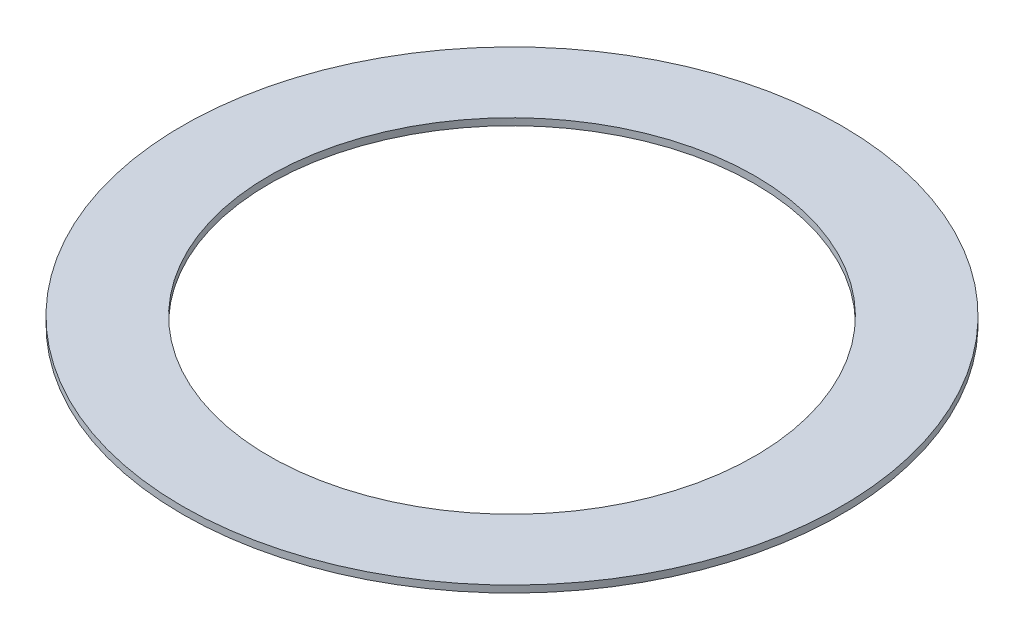
ISO-10303-21;
HEADER;
FILE_DESCRIPTION(('STEP AP214'),'2;1');
FILE_NAME('part.step','',(''),(''),'','','');
FILE_SCHEMA(('AUTOMOTIVE_DESIGN { 1 0 10303 214 1 1 1 1 }'));
ENDSEC;
DATA;
#1=APPLICATION_CONTEXT('core data for automotive mechanical design processes');
#2=APPLICATION_PROTOCOL_DEFINITION('international standard','automotive_design',2000,#1);
#3=PRODUCT_CONTEXT('',#1,'mechanical');
#4=PRODUCT('Part','Part','',(#3));
#5=PRODUCT_RELATED_PRODUCT_CATEGORY('part','',(#4));
#6=PRODUCT_DEFINITION_FORMATION('','',#4);
#7=PRODUCT_DEFINITION_CONTEXT('part definition',#1,'design');
#8=PRODUCT_DEFINITION('design','',#6,#7);
#9=PRODUCT_DEFINITION_SHAPE('','',#8);
#10=(LENGTH_UNIT() NAMED_UNIT(*) SI_UNIT(.MILLI.,.METRE.));
#11=(NAMED_UNIT(*) PLANE_ANGLE_UNIT() SI_UNIT($,.RADIAN.));
#12=(NAMED_UNIT(*) SI_UNIT($,.STERADIAN.) SOLID_ANGLE_UNIT());
#13=UNCERTAINTY_MEASURE_WITH_UNIT(LENGTH_MEASURE(1.E-05),#10,'distance_accuracy_value','');
#14=(GEOMETRIC_REPRESENTATION_CONTEXT(3) GLOBAL_UNCERTAINTY_ASSIGNED_CONTEXT((#13)) GLOBAL_UNIT_ASSIGNED_CONTEXT((#10,
#11,#12)) REPRESENTATION_CONTEXT('',''));
#15=CARTESIAN_POINT('',(0.,0.,0.));
#16=DIRECTION('',(0.,0.,1.));
#17=DIRECTION('',(1.,0.,0.));
#18=AXIS2_PLACEMENT_3D('',#15,#16,#17);
#19=CARTESIAN_POINT('',(0.,0.,0.));
#20=DIRECTION('',(0.,-1.,0.));
#21=DIRECTION('',(0.,0.,-1.));
#22=AXIS2_PLACEMENT_3D('',#19,#20,#21);
#23=CYLINDRICAL_SURFACE('',#22,35.);
#24=CARTESIAN_POINT('',(0.,0.,0.));
#25=DIRECTION('',(0.,-1.,0.));
#26=DIRECTION('',(0.,0.,-1.));
#27=AXIS2_PLACEMENT_3D('',#24,#25,#26);
#28=CIRCLE('',#27,35.);
#29=CARTESIAN_POINT('',(0.,0.,-35.));
#30=VERTEX_POINT('',#29);
#31=EDGE_CURVE('E10',#30,#30,#28,.T.);
#32=ORIENTED_EDGE('',*,*,#31,.T.);
#33=EDGE_LOOP('',(#32));
#34=FACE_BOUND('',#33,.T.);
#35=CARTESIAN_POINT('',(0.,0.999999999999999,0.));
#36=DIRECTION('',(0.,-1.,0.));
#37=DIRECTION('',(0.,0.,-1.));
#38=AXIS2_PLACEMENT_3D('',#35,#36,#37);
#39=CIRCLE('',#38,35.);
#40=CARTESIAN_POINT('',(0.,0.999999999999999,-35.));
#41=VERTEX_POINT('',#40);
#42=EDGE_CURVE('E52',#41,#41,#39,.T.);
#43=ORIENTED_EDGE('',*,*,#42,.F.);
#44=EDGE_LOOP('',(#43));
#45=FACE_BOUND('',#44,.T.);
#46=ADVANCED_FACE('F39',(#34,#45),#23,.F.);
#47=CARTESIAN_POINT('',(35.,0.,0.));
#48=DIRECTION('',(0.,-1.,0.));
#49=DIRECTION('',(0.,0.,-1.));
#50=AXIS2_PLACEMENT_3D('',#47,#48,#49);
#51=PLANE('',#50);
#52=CARTESIAN_POINT('',(0.,0.,0.));
#53=DIRECTION('',(0.,-1.,0.));
#54=DIRECTION('',(0.,0.,-1.));
#55=AXIS2_PLACEMENT_3D('',#52,#53,#54);
#56=CIRCLE('',#55,47.5);
#57=CARTESIAN_POINT('',(0.,0.,-47.5));
#58=VERTEX_POINT('',#57);
#59=EDGE_CURVE('E44',#58,#58,#56,.T.);
#60=ORIENTED_EDGE('',*,*,#59,.T.);
#61=EDGE_LOOP('',(#60));
#62=FACE_BOUND('',#61,.T.);
#63=ORIENTED_EDGE('',*,*,#31,.F.);
#64=EDGE_LOOP('',(#63));
#65=FACE_BOUND('',#64,.T.);
#66=ADVANCED_FACE('F62',(#62,#65),#51,.T.);
#67=CARTESIAN_POINT('',(0.,0.,0.));
#68=DIRECTION('',(0.,-1.,0.));
#69=DIRECTION('',(0.,0.,-1.));
#70=AXIS2_PLACEMENT_3D('',#67,#68,#69);
#71=CYLINDRICAL_SURFACE('',#70,47.5);
#72=CARTESIAN_POINT('',(0.,1.,0.));
#73=DIRECTION('',(0.,-1.,0.));
#74=DIRECTION('',(0.,0.,-1.));
#75=AXIS2_PLACEMENT_3D('',#72,#73,#74);
#76=CIRCLE('',#75,47.5);
#77=CARTESIAN_POINT('',(0.,1.,-47.5));
#78=VERTEX_POINT('',#77);
#79=EDGE_CURVE('E47',#78,#78,#76,.T.);
#80=ORIENTED_EDGE('',*,*,#79,.T.);
#81=EDGE_LOOP('',(#80));
#82=FACE_BOUND('',#81,.T.);
#83=ORIENTED_EDGE('',*,*,#59,.F.);
#84=EDGE_LOOP('',(#83));
#85=FACE_BOUND('',#84,.T.);
#86=ADVANCED_FACE('F69',(#82,#85),#71,.T.);
#87=CARTESIAN_POINT('',(47.5,0.999999999999999,0.));
#88=DIRECTION('',(0.,1.,0.));
#89=DIRECTION('',(0.,0.,1.));
#90=AXIS2_PLACEMENT_3D('',#87,#88,#89);
#91=PLANE('',#90);
#92=ORIENTED_EDGE('',*,*,#42,.T.);
#93=EDGE_LOOP('',(#92));
#94=FACE_BOUND('',#93,.T.);
#95=ORIENTED_EDGE('',*,*,#79,.F.);
#96=EDGE_LOOP('',(#95));
#97=FACE_BOUND('',#96,.T.);
#98=ADVANCED_FACE('F56',(#94,#97),#91,.T.);
#99=CLOSED_SHELL('',(#46,#66,#86,#98));
#100=MANIFOLD_SOLID_BREP('B2',#99);
#101=ADVANCED_BREP_SHAPE_REPRESENTATION('',(#18,#100),#14);
#102=SHAPE_DEFINITION_REPRESENTATION(#9,#101);
ENDSEC;
END-ISO-10303-21;
